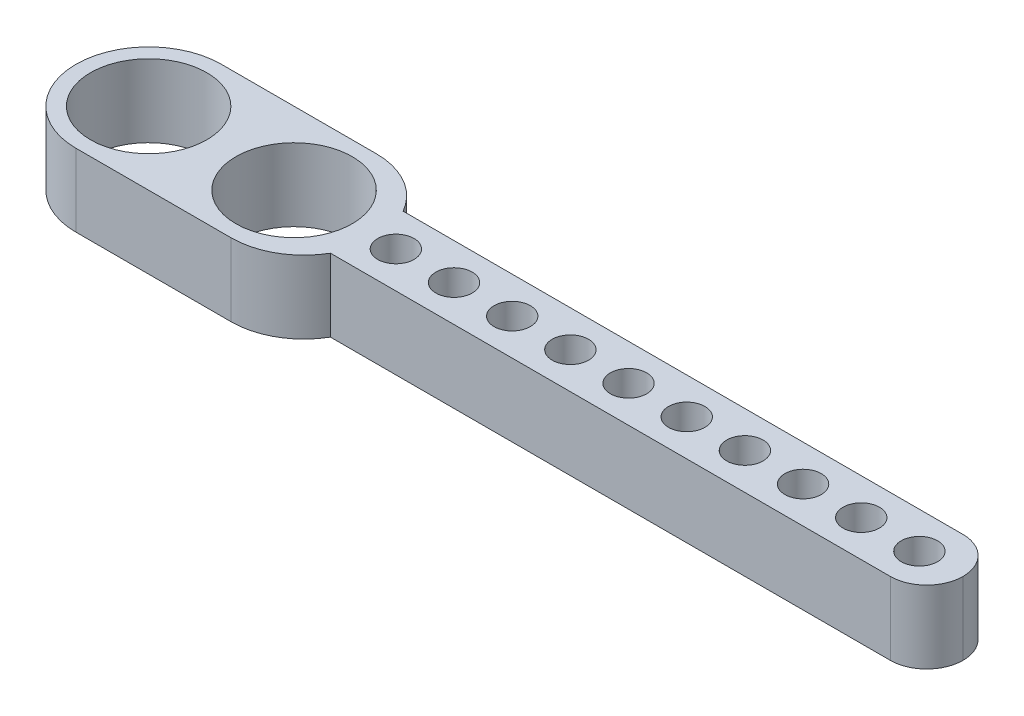
ISO-10303-21;
HEADER;
FILE_DESCRIPTION(('STEP AP214'),'2;1');
FILE_NAME('part.step','',(''),(''),'','','');
FILE_SCHEMA(('AUTOMOTIVE_DESIGN { 1 0 10303 214 1 1 1 1 }'));
ENDSEC;
DATA;
#1=APPLICATION_CONTEXT('core data for automotive mechanical design processes');
#2=APPLICATION_PROTOCOL_DEFINITION('international standard','automotive_design',2000,#1);
#3=PRODUCT_CONTEXT('',#1,'mechanical');
#4=PRODUCT('Part','Part','',(#3));
#5=PRODUCT_RELATED_PRODUCT_CATEGORY('part','',(#4));
#6=PRODUCT_DEFINITION_FORMATION('','',#4);
#7=PRODUCT_DEFINITION_CONTEXT('part definition',#1,'design');
#8=PRODUCT_DEFINITION('design','',#6,#7);
#9=PRODUCT_DEFINITION_SHAPE('','',#8);
#10=(LENGTH_UNIT() NAMED_UNIT(*) SI_UNIT(.MILLI.,.METRE.));
#11=(NAMED_UNIT(*) PLANE_ANGLE_UNIT() SI_UNIT($,.RADIAN.));
#12=(NAMED_UNIT(*) SI_UNIT($,.STERADIAN.) SOLID_ANGLE_UNIT());
#13=UNCERTAINTY_MEASURE_WITH_UNIT(LENGTH_MEASURE(1.E-05),#10,'distance_accuracy_value','');
#14=(GEOMETRIC_REPRESENTATION_CONTEXT(3) GLOBAL_UNCERTAINTY_ASSIGNED_CONTEXT((#13)) GLOBAL_UNIT_ASSIGNED_CONTEXT((#10,
#11,#12)) REPRESENTATION_CONTEXT('',''));
#15=CARTESIAN_POINT('',(0.,0.,0.));
#16=DIRECTION('',(0.,0.,1.));
#17=DIRECTION('',(1.,0.,0.));
#18=AXIS2_PLACEMENT_3D('',#15,#16,#17);
#19=CARTESIAN_POINT('',(0.,6.35,0.));
#20=DIRECTION('',(0.,0.,-1.));
#21=DIRECTION('',(-1.,0.,0.));
#22=AXIS2_PLACEMENT_3D('',#19,#20,#21);
#23=PLANE('',#22);
#24=DIRECTION('',(1.,0.,0.));
#25=VECTOR('',#24,1.);
#26=CARTESIAN_POINT('',(0.,0.,0.));
#27=LINE('',#26,#25);
#28=CARTESIAN_POINT('',(6.35,0.,0.));
#29=VERTEX_POINT('',#28);
#30=CARTESIAN_POINT('',(19.9007386859688,0.,0.));
#31=VERTEX_POINT('',#30);
#32=EDGE_CURVE('E232',#29,#31,#27,.T.);
#33=ORIENTED_EDGE('',*,*,#32,.T.);
#34=DIRECTION('',(0.,-1.,0.));
#35=VECTOR('',#34,1.);
#36=CARTESIAN_POINT('',(19.9007386859688,6.35,0.));
#37=LINE('',#36,#35);
#38=CARTESIAN_POINT('',(19.9007386859688,6.35,0.));
#39=VERTEX_POINT('',#38);
#40=EDGE_CURVE('E182',#31,#39,#37,.F.);
#41=ORIENTED_EDGE('',*,*,#40,.T.);
#42=DIRECTION('',(1.,0.,0.));
#43=VECTOR('',#42,1.);
#44=CARTESIAN_POINT('',(0.,6.35,0.));
#45=LINE('',#44,#43);
#46=CARTESIAN_POINT('',(6.35,6.35,0.));
#47=VERTEX_POINT('',#46);
#48=EDGE_CURVE('E127',#47,#39,#45,.T.);
#49=ORIENTED_EDGE('',*,*,#48,.F.);
#50=DIRECTION('',(0.,-1.,0.));
#51=VECTOR('',#50,1.);
#52=CARTESIAN_POINT('',(6.35,0.,0.));
#53=LINE('',#52,#51);
#54=EDGE_CURVE('E179',#47,#29,#53,.T.);
#55=ORIENTED_EDGE('',*,*,#54,.T.);
#56=EDGE_LOOP('',(#33,#41,#49,#55));
#57=FACE_BOUND('',#56,.T.);
#58=ADVANCED_FACE('F44',(#57),#23,.F.);
#59=CARTESIAN_POINT('',(0.,6.35,-3.175));
#60=DIRECTION('',(0.,0.,-1.));
#61=DIRECTION('',(-1.,0.,0.));
#62=AXIS2_PLACEMENT_3D('',#59,#60,#61);
#63=PLANE('',#62);
#64=DIRECTION('',(1.,0.,0.));
#65=VECTOR('',#64,1.);
#66=CARTESIAN_POINT('',(0.,0.,-3.175));
#67=LINE('',#66,#65);
#68=CARTESIAN_POINT('',(25.4,0.,-3.175));
#69=VERTEX_POINT('',#68);
#70=CARTESIAN_POINT('',(74.295,0.,-3.175));
#71=VERTEX_POINT('',#70);
#72=EDGE_CURVE('E236',#69,#71,#67,.T.);
#73=ORIENTED_EDGE('',*,*,#72,.T.);
#74=DIRECTION('',(0.,-1.,0.));
#75=VECTOR('',#74,1.);
#76=CARTESIAN_POINT('',(74.295,6.35,-3.175));
#77=LINE('',#76,#75);
#78=CARTESIAN_POINT('',(74.295,6.35,-3.175));
#79=VERTEX_POINT('',#78);
#80=EDGE_CURVE('E11',#71,#79,#77,.F.);
#81=ORIENTED_EDGE('',*,*,#80,.T.);
#82=DIRECTION('',(1.,0.,0.));
#83=VECTOR('',#82,1.);
#84=CARTESIAN_POINT('',(0.,6.35,-3.175));
#85=LINE('',#84,#83);
#86=CARTESIAN_POINT('',(25.4,6.35,-3.175));
#87=VERTEX_POINT('',#86);
#88=EDGE_CURVE('E125',#87,#79,#85,.T.);
#89=ORIENTED_EDGE('',*,*,#88,.F.);
#90=DIRECTION('',(0.,-1.,0.));
#91=VECTOR('',#90,1.);
#92=CARTESIAN_POINT('',(25.4,6.35,-3.175));
#93=LINE('',#92,#91);
#94=EDGE_CURVE('E137',#87,#69,#93,.T.);
#95=ORIENTED_EDGE('',*,*,#94,.T.);
#96=EDGE_LOOP('',(#73,#81,#89,#95));
#97=FACE_BOUND('',#96,.T.);
#98=ADVANCED_FACE('F136',(#97),#63,.F.);
#99=CARTESIAN_POINT('',(0.,6.35,-9.525));
#100=DIRECTION('',(0.,0.,-1.));
#101=DIRECTION('',(-1.,0.,0.));
#102=AXIS2_PLACEMENT_3D('',#99,#100,#101);
#103=PLANE('',#102);
#104=DIRECTION('',(1.,0.,0.));
#105=VECTOR('',#104,1.);
#106=CARTESIAN_POINT('',(0.,6.35,-9.525));
#107=LINE('',#106,#105);
#108=CARTESIAN_POINT('',(25.4,6.35,-9.525));
#109=VERTEX_POINT('',#108);
#110=CARTESIAN_POINT('',(74.295,6.35,-9.525));
#111=VERTEX_POINT('',#110);
#112=EDGE_CURVE('E140',#109,#111,#107,.T.);
#113=ORIENTED_EDGE('',*,*,#112,.T.);
#114=DIRECTION('',(0.,-1.,0.));
#115=VECTOR('',#114,1.);
#116=CARTESIAN_POINT('',(74.295,6.35,-9.525));
#117=LINE('',#116,#115);
#118=CARTESIAN_POINT('',(74.295,0.,-9.525));
#119=VERTEX_POINT('',#118);
#120=EDGE_CURVE('E185',#111,#119,#117,.T.);
#121=ORIENTED_EDGE('',*,*,#120,.T.);
#122=DIRECTION('',(1.,0.,0.));
#123=VECTOR('',#122,1.);
#124=CARTESIAN_POINT('',(0.,0.,-9.525));
#125=LINE('',#124,#123);
#126=CARTESIAN_POINT('',(25.4,0.,-9.525));
#127=VERTEX_POINT('',#126);
#128=EDGE_CURVE('E222',#127,#119,#125,.T.);
#129=ORIENTED_EDGE('',*,*,#128,.F.);
#130=DIRECTION('',(0.,-1.,0.));
#131=VECTOR('',#130,1.);
#132=CARTESIAN_POINT('',(25.4,6.35,-9.525));
#133=LINE('',#132,#131);
#134=EDGE_CURVE('E146',#109,#127,#133,.T.);
#135=ORIENTED_EDGE('',*,*,#134,.F.);
#136=EDGE_LOOP('',(#113,#121,#129,#135));
#137=FACE_BOUND('',#136,.T.);
#138=ADVANCED_FACE('F211',(#137),#103,.T.);
#139=CARTESIAN_POINT('',(0.,6.35,-12.7));
#140=DIRECTION('',(0.,0.,-1.));
#141=DIRECTION('',(-1.,0.,0.));
#142=AXIS2_PLACEMENT_3D('',#139,#140,#141);
#143=PLANE('',#142);
#144=DIRECTION('',(1.,0.,0.));
#145=VECTOR('',#144,1.);
#146=CARTESIAN_POINT('',(0.,6.35,-12.7));
#147=LINE('',#146,#145);
#148=CARTESIAN_POINT('',(6.35,6.35,-12.7));
#149=VERTEX_POINT('',#148);
#150=CARTESIAN_POINT('',(19.9007386859688,6.35,-12.7));
#151=VERTEX_POINT('',#150);
#152=EDGE_CURVE('E215',#149,#151,#147,.T.);
#153=ORIENTED_EDGE('',*,*,#152,.T.);
#154=DIRECTION('',(0.,1.,0.));
#155=VECTOR('',#154,1.);
#156=CARTESIAN_POINT('',(19.9007386859688,0.,-12.7));
#157=LINE('',#156,#155);
#158=CARTESIAN_POINT('',(19.9007386859688,0.,-12.7));
#159=VERTEX_POINT('',#158);
#160=EDGE_CURVE('E151',#151,#159,#157,.F.);
#161=ORIENTED_EDGE('',*,*,#160,.T.);
#162=DIRECTION('',(1.,0.,0.));
#163=VECTOR('',#162,1.);
#164=CARTESIAN_POINT('',(0.,0.,-12.7));
#165=LINE('',#164,#163);
#166=CARTESIAN_POINT('',(6.35,0.,-12.7));
#167=VERTEX_POINT('',#166);
#168=EDGE_CURVE('E241',#167,#159,#165,.T.);
#169=ORIENTED_EDGE('',*,*,#168,.F.);
#170=DIRECTION('',(0.,-1.,0.));
#171=VECTOR('',#170,1.);
#172=CARTESIAN_POINT('',(6.35,6.35,-12.7));
#173=LINE('',#172,#171);
#174=EDGE_CURVE('E145',#167,#149,#173,.F.);
#175=ORIENTED_EDGE('',*,*,#174,.T.);
#176=EDGE_LOOP('',(#153,#161,#169,#175));
#177=FACE_BOUND('',#176,.T.);
#178=ADVANCED_FACE('F434',(#177),#143,.T.);
#179=CARTESIAN_POINT('',(33.02,6.35,-6.35));
#180=DIRECTION('',(0.,-1.,0.));
#181=DIRECTION('',(0.,0.,-1.));
#182=AXIS2_PLACEMENT_3D('',#179,#180,#181);
#183=CYLINDRICAL_SURFACE('',#182,1.5875);
#184=CARTESIAN_POINT('',(33.02,6.35,-6.35));
#185=DIRECTION('',(0.,1.,0.));
#186=DIRECTION('',(0.,0.,1.));
#187=AXIS2_PLACEMENT_3D('',#184,#185,#186);
#188=CIRCLE('',#187,1.5875);
#189=CARTESIAN_POINT('',(33.02,6.35,-4.7625));
#190=VERTEX_POINT('',#189);
#191=EDGE_CURVE('E329',#190,#190,#188,.T.);
#192=ORIENTED_EDGE('',*,*,#191,.T.);
#193=EDGE_LOOP('',(#192));
#194=FACE_BOUND('',#193,.T.);
#195=CARTESIAN_POINT('',(33.02,0.,-6.35));
#196=DIRECTION('',(0.,1.,0.));
#197=DIRECTION('',(0.,0.,1.));
#198=AXIS2_PLACEMENT_3D('',#195,#196,#197);
#199=CIRCLE('',#198,1.5875);
#200=CARTESIAN_POINT('',(33.02,0.,-4.7625));
#201=VERTEX_POINT('',#200);
#202=EDGE_CURVE('E277',#201,#201,#199,.T.);
#203=ORIENTED_EDGE('',*,*,#202,.F.);
#204=EDGE_LOOP('',(#203));
#205=FACE_BOUND('',#204,.T.);
#206=ADVANCED_FACE('F444',(#194,#205),#183,.F.);
#207=CARTESIAN_POINT('',(38.1,6.35,-6.35));
#208=DIRECTION('',(0.,-1.,0.));
#209=DIRECTION('',(0.,0.,-1.));
#210=AXIS2_PLACEMENT_3D('',#207,#208,#209);
#211=CYLINDRICAL_SURFACE('',#210,1.5875);
#212=CARTESIAN_POINT('',(38.1,6.35,-6.35));
#213=DIRECTION('',(0.,1.,0.));
#214=DIRECTION('',(0.,0.,1.));
#215=AXIS2_PLACEMENT_3D('',#212,#213,#214);
#216=CIRCLE('',#215,1.5875);
#217=CARTESIAN_POINT('',(38.1,6.35,-4.7625));
#218=VERTEX_POINT('',#217);
#219=EDGE_CURVE('E325',#218,#218,#216,.T.);
#220=ORIENTED_EDGE('',*,*,#219,.T.);
#221=EDGE_LOOP('',(#220));
#222=FACE_BOUND('',#221,.T.);
#223=CARTESIAN_POINT('',(38.1,0.,-6.35));
#224=DIRECTION('',(0.,1.,0.));
#225=DIRECTION('',(0.,0.,1.));
#226=AXIS2_PLACEMENT_3D('',#223,#224,#225);
#227=CIRCLE('',#226,1.5875);
#228=CARTESIAN_POINT('',(38.1,0.,-4.7625));
#229=VERTEX_POINT('',#228);
#230=EDGE_CURVE('E273',#229,#229,#227,.T.);
#231=ORIENTED_EDGE('',*,*,#230,.F.);
#232=EDGE_LOOP('',(#231));
#233=FACE_BOUND('',#232,.T.);
#234=ADVANCED_FACE('F454',(#222,#233),#211,.F.);
#235=CARTESIAN_POINT('',(43.18,6.35,-6.35));
#236=DIRECTION('',(0.,-1.,0.));
#237=DIRECTION('',(0.,0.,-1.));
#238=AXIS2_PLACEMENT_3D('',#235,#236,#237);
#239=CYLINDRICAL_SURFACE('',#238,1.5875);
#240=CARTESIAN_POINT('',(43.18,6.35,-6.35));
#241=DIRECTION('',(0.,1.,0.));
#242=DIRECTION('',(0.,0.,1.));
#243=AXIS2_PLACEMENT_3D('',#240,#241,#242);
#244=CIRCLE('',#243,1.5875);
#245=CARTESIAN_POINT('',(43.18,6.35,-4.7625));
#246=VERTEX_POINT('',#245);
#247=EDGE_CURVE('E321',#246,#246,#244,.T.);
#248=ORIENTED_EDGE('',*,*,#247,.T.);
#249=EDGE_LOOP('',(#248));
#250=FACE_BOUND('',#249,.T.);
#251=CARTESIAN_POINT('',(43.18,0.,-6.35));
#252=DIRECTION('',(0.,1.,0.));
#253=DIRECTION('',(0.,0.,1.));
#254=AXIS2_PLACEMENT_3D('',#251,#252,#253);
#255=CIRCLE('',#254,1.5875);
#256=CARTESIAN_POINT('',(43.18,0.,-4.7625));
#257=VERTEX_POINT('',#256);
#258=EDGE_CURVE('E269',#257,#257,#255,.T.);
#259=ORIENTED_EDGE('',*,*,#258,.F.);
#260=EDGE_LOOP('',(#259));
#261=FACE_BOUND('',#260,.T.);
#262=ADVANCED_FACE('F464',(#250,#261),#239,.F.);
#263=CARTESIAN_POINT('',(48.26,6.35,-6.35));
#264=DIRECTION('',(0.,-1.,0.));
#265=DIRECTION('',(0.,0.,-1.));
#266=AXIS2_PLACEMENT_3D('',#263,#264,#265);
#267=CYLINDRICAL_SURFACE('',#266,1.5875);
#268=CARTESIAN_POINT('',(48.26,6.35,-6.35));
#269=DIRECTION('',(0.,1.,0.));
#270=DIRECTION('',(0.,0.,1.));
#271=AXIS2_PLACEMENT_3D('',#268,#269,#270);
#272=CIRCLE('',#271,1.5875);
#273=CARTESIAN_POINT('',(48.26,6.35,-4.7625));
#274=VERTEX_POINT('',#273);
#275=EDGE_CURVE('E317',#274,#274,#272,.T.);
#276=ORIENTED_EDGE('',*,*,#275,.T.);
#277=EDGE_LOOP('',(#276));
#278=FACE_BOUND('',#277,.T.);
#279=CARTESIAN_POINT('',(48.26,0.,-6.35));
#280=DIRECTION('',(0.,1.,0.));
#281=DIRECTION('',(0.,0.,1.));
#282=AXIS2_PLACEMENT_3D('',#279,#280,#281);
#283=CIRCLE('',#282,1.5875);
#284=CARTESIAN_POINT('',(48.26,0.,-4.7625));
#285=VERTEX_POINT('',#284);
#286=EDGE_CURVE('E265',#285,#285,#283,.T.);
#287=ORIENTED_EDGE('',*,*,#286,.F.);
#288=EDGE_LOOP('',(#287));
#289=FACE_BOUND('',#288,.T.);
#290=ADVANCED_FACE('F474',(#278,#289),#267,.F.);
#291=CARTESIAN_POINT('',(53.34,6.35,-6.35));
#292=DIRECTION('',(0.,-1.,0.));
#293=DIRECTION('',(0.,0.,-1.));
#294=AXIS2_PLACEMENT_3D('',#291,#292,#293);
#295=CYLINDRICAL_SURFACE('',#294,1.5875);
#296=CARTESIAN_POINT('',(53.34,6.35,-6.35));
#297=DIRECTION('',(0.,1.,0.));
#298=DIRECTION('',(0.,0.,1.));
#299=AXIS2_PLACEMENT_3D('',#296,#297,#298);
#300=CIRCLE('',#299,1.5875);
#301=CARTESIAN_POINT('',(53.34,6.35,-4.7625));
#302=VERTEX_POINT('',#301);
#303=EDGE_CURVE('E313',#302,#302,#300,.T.);
#304=ORIENTED_EDGE('',*,*,#303,.T.);
#305=EDGE_LOOP('',(#304));
#306=FACE_BOUND('',#305,.T.);
#307=CARTESIAN_POINT('',(53.34,0.,-6.35));
#308=DIRECTION('',(0.,1.,0.));
#309=DIRECTION('',(0.,0.,1.));
#310=AXIS2_PLACEMENT_3D('',#307,#308,#309);
#311=CIRCLE('',#310,1.5875);
#312=CARTESIAN_POINT('',(53.34,0.,-4.7625));
#313=VERTEX_POINT('',#312);
#314=EDGE_CURVE('E261',#313,#313,#311,.T.);
#315=ORIENTED_EDGE('',*,*,#314,.F.);
#316=EDGE_LOOP('',(#315));
#317=FACE_BOUND('',#316,.T.);
#318=ADVANCED_FACE('F484',(#306,#317),#295,.F.);
#319=CARTESIAN_POINT('',(58.42,6.35,-6.35));
#320=DIRECTION('',(0.,-1.,0.));
#321=DIRECTION('',(0.,0.,-1.));
#322=AXIS2_PLACEMENT_3D('',#319,#320,#321);
#323=CYLINDRICAL_SURFACE('',#322,1.5875);
#324=CARTESIAN_POINT('',(58.42,6.35,-6.35));
#325=DIRECTION('',(0.,1.,0.));
#326=DIRECTION('',(0.,0.,1.));
#327=AXIS2_PLACEMENT_3D('',#324,#325,#326);
#328=CIRCLE('',#327,1.5875);
#329=CARTESIAN_POINT('',(58.42,6.35,-4.7625));
#330=VERTEX_POINT('',#329);
#331=EDGE_CURVE('E309',#330,#330,#328,.T.);
#332=ORIENTED_EDGE('',*,*,#331,.T.);
#333=EDGE_LOOP('',(#332));
#334=FACE_BOUND('',#333,.T.);
#335=CARTESIAN_POINT('',(58.42,0.,-6.35));
#336=DIRECTION('',(0.,1.,0.));
#337=DIRECTION('',(0.,0.,1.));
#338=AXIS2_PLACEMENT_3D('',#335,#336,#337);
#339=CIRCLE('',#338,1.5875);
#340=CARTESIAN_POINT('',(58.42,0.,-4.7625));
#341=VERTEX_POINT('',#340);
#342=EDGE_CURVE('E257',#341,#341,#339,.T.);
#343=ORIENTED_EDGE('',*,*,#342,.F.);
#344=EDGE_LOOP('',(#343));
#345=FACE_BOUND('',#344,.T.);
#346=ADVANCED_FACE('F494',(#334,#345),#323,.F.);
#347=CARTESIAN_POINT('',(63.5,6.35,-6.35));
#348=DIRECTION('',(0.,-1.,0.));
#349=DIRECTION('',(0.,0.,-1.));
#350=AXIS2_PLACEMENT_3D('',#347,#348,#349);
#351=CYLINDRICAL_SURFACE('',#350,1.5875);
#352=CARTESIAN_POINT('',(63.5,6.35,-6.35));
#353=DIRECTION('',(0.,1.,0.));
#354=DIRECTION('',(0.,0.,1.));
#355=AXIS2_PLACEMENT_3D('',#352,#353,#354);
#356=CIRCLE('',#355,1.5875);
#357=CARTESIAN_POINT('',(63.5,6.35,-4.7625));
#358=VERTEX_POINT('',#357);
#359=EDGE_CURVE('E305',#358,#358,#356,.T.);
#360=ORIENTED_EDGE('',*,*,#359,.T.);
#361=EDGE_LOOP('',(#360));
#362=FACE_BOUND('',#361,.T.);
#363=CARTESIAN_POINT('',(63.5,0.,-6.35));
#364=DIRECTION('',(0.,1.,0.));
#365=DIRECTION('',(0.,0.,1.));
#366=AXIS2_PLACEMENT_3D('',#363,#364,#365);
#367=CIRCLE('',#366,1.5875);
#368=CARTESIAN_POINT('',(63.5,0.,-4.7625));
#369=VERTEX_POINT('',#368);
#370=EDGE_CURVE('E253',#369,#369,#367,.T.);
#371=ORIENTED_EDGE('',*,*,#370,.F.);
#372=EDGE_LOOP('',(#371));
#373=FACE_BOUND('',#372,.T.);
#374=ADVANCED_FACE('F504',(#362,#373),#351,.F.);
#375=CARTESIAN_POINT('',(68.58,6.35,-6.35));
#376=DIRECTION('',(0.,-1.,0.));
#377=DIRECTION('',(0.,0.,-1.));
#378=AXIS2_PLACEMENT_3D('',#375,#376,#377);
#379=CYLINDRICAL_SURFACE('',#378,1.5875);
#380=CARTESIAN_POINT('',(68.58,6.35,-6.35));
#381=DIRECTION('',(0.,1.,0.));
#382=DIRECTION('',(0.,0.,1.));
#383=AXIS2_PLACEMENT_3D('',#380,#381,#382);
#384=CIRCLE('',#383,1.5875);
#385=CARTESIAN_POINT('',(68.58,6.35,-4.7625));
#386=VERTEX_POINT('',#385);
#387=EDGE_CURVE('E301',#386,#386,#384,.T.);
#388=ORIENTED_EDGE('',*,*,#387,.T.);
#389=EDGE_LOOP('',(#388));
#390=FACE_BOUND('',#389,.T.);
#391=CARTESIAN_POINT('',(68.58,0.,-6.35));
#392=DIRECTION('',(0.,1.,0.));
#393=DIRECTION('',(0.,0.,1.));
#394=AXIS2_PLACEMENT_3D('',#391,#392,#393);
#395=CIRCLE('',#394,1.5875);
#396=CARTESIAN_POINT('',(68.58,0.,-4.7625));
#397=VERTEX_POINT('',#396);
#398=EDGE_CURVE('E249',#397,#397,#395,.T.);
#399=ORIENTED_EDGE('',*,*,#398,.F.);
#400=EDGE_LOOP('',(#399));
#401=FACE_BOUND('',#400,.T.);
#402=ADVANCED_FACE('F514',(#390,#401),#379,.F.);
#403=CARTESIAN_POINT('',(73.66,6.35,-6.35));
#404=DIRECTION('',(0.,-1.,0.));
#405=DIRECTION('',(0.,0.,-1.));
#406=AXIS2_PLACEMENT_3D('',#403,#404,#405);
#407=CYLINDRICAL_SURFACE('',#406,1.5875);
#408=CARTESIAN_POINT('',(73.66,6.35,-6.35));
#409=DIRECTION('',(0.,1.,0.));
#410=DIRECTION('',(0.,0.,1.));
#411=AXIS2_PLACEMENT_3D('',#408,#409,#410);
#412=CIRCLE('',#411,1.5875);
#413=CARTESIAN_POINT('',(73.66,6.35,-4.7625));
#414=VERTEX_POINT('',#413);
#415=EDGE_CURVE('E297',#414,#414,#412,.T.);
#416=ORIENTED_EDGE('',*,*,#415,.T.);
#417=EDGE_LOOP('',(#416));
#418=FACE_BOUND('',#417,.T.);
#419=CARTESIAN_POINT('',(73.66,0.,-6.35));
#420=DIRECTION('',(0.,1.,0.));
#421=DIRECTION('',(0.,0.,1.));
#422=AXIS2_PLACEMENT_3D('',#419,#420,#421);
#423=CIRCLE('',#422,1.5875);
#424=CARTESIAN_POINT('',(73.66,0.,-4.7625));
#425=VERTEX_POINT('',#424);
#426=EDGE_CURVE('E245',#425,#425,#423,.T.);
#427=ORIENTED_EDGE('',*,*,#426,.F.);
#428=EDGE_LOOP('',(#427));
#429=FACE_BOUND('',#428,.T.);
#430=ADVANCED_FACE('F369',(#418,#429),#407,.F.);
#431=CARTESIAN_POINT('',(6.35,6.35,-6.35));
#432=DIRECTION('',(0.,-1.,0.));
#433=DIRECTION('',(0.,0.,-1.));
#434=AXIS2_PLACEMENT_3D('',#431,#432,#433);
#435=CYLINDRICAL_SURFACE('',#434,5.08);
#436=CARTESIAN_POINT('',(6.35,6.35,-6.35));
#437=DIRECTION('',(0.,1.,0.));
#438=DIRECTION('',(0.,0.,1.));
#439=AXIS2_PLACEMENT_3D('',#436,#437,#438);
#440=CIRCLE('',#439,5.08);
#441=CARTESIAN_POINT('',(6.35,6.35,-1.27));
#442=VERTEX_POINT('',#441);
#443=EDGE_CURVE('E288',#442,#442,#440,.T.);
#444=ORIENTED_EDGE('',*,*,#443,.T.);
#445=EDGE_LOOP('',(#444));
#446=FACE_BOUND('',#445,.T.);
#447=CARTESIAN_POINT('',(6.35,0.,-6.35));
#448=DIRECTION('',(0.,1.,0.));
#449=DIRECTION('',(0.,0.,1.));
#450=AXIS2_PLACEMENT_3D('',#447,#448,#449);
#451=CIRCLE('',#450,5.08);
#452=CARTESIAN_POINT('',(6.35,0.,-1.27));
#453=VERTEX_POINT('',#452);
#454=EDGE_CURVE('E228',#453,#453,#451,.T.);
#455=ORIENTED_EDGE('',*,*,#454,.F.);
#456=EDGE_LOOP('',(#455));
#457=FACE_BOUND('',#456,.T.);
#458=ADVANCED_FACE('F366',(#446,#457),#435,.F.);
#459=CARTESIAN_POINT('',(19.05,6.35,-6.35));
#460=DIRECTION('',(0.,-1.,0.));
#461=DIRECTION('',(0.,0.,-1.));
#462=AXIS2_PLACEMENT_3D('',#459,#460,#461);
#463=CYLINDRICAL_SURFACE('',#462,5.08);
#464=CARTESIAN_POINT('',(19.05,6.35,-6.35));
#465=DIRECTION('',(0.,1.,0.));
#466=DIRECTION('',(0.,0.,1.));
#467=AXIS2_PLACEMENT_3D('',#464,#465,#466);
#468=CIRCLE('',#467,5.08);
#469=CARTESIAN_POINT('',(19.05,6.35,-1.27));
#470=VERTEX_POINT('',#469);
#471=EDGE_CURVE('E285',#470,#470,#468,.T.);
#472=ORIENTED_EDGE('',*,*,#471,.T.);
#473=EDGE_LOOP('',(#472));
#474=FACE_BOUND('',#473,.T.);
#475=CARTESIAN_POINT('',(19.05,0.,-6.35));
#476=DIRECTION('',(0.,1.,0.));
#477=DIRECTION('',(0.,0.,1.));
#478=AXIS2_PLACEMENT_3D('',#475,#476,#477);
#479=CIRCLE('',#478,5.08);
#480=CARTESIAN_POINT('',(19.05,0.,-1.27));
#481=VERTEX_POINT('',#480);
#482=EDGE_CURVE('E190',#481,#481,#479,.T.);
#483=ORIENTED_EDGE('',*,*,#482,.F.);
#484=EDGE_LOOP('',(#483));
#485=FACE_BOUND('',#484,.T.);
#486=ADVANCED_FACE('F352',(#474,#485),#463,.F.);
#487=CARTESIAN_POINT('',(27.94,6.35,-6.35));
#488=DIRECTION('',(0.,-1.,0.));
#489=DIRECTION('',(0.,0.,-1.));
#490=AXIS2_PLACEMENT_3D('',#487,#488,#489);
#491=CYLINDRICAL_SURFACE('',#490,1.5875);
#492=CARTESIAN_POINT('',(27.94,6.35,-6.35));
#493=DIRECTION('',(0.,1.,0.));
#494=DIRECTION('',(0.,0.,1.));
#495=AXIS2_PLACEMENT_3D('',#492,#493,#494);
#496=CIRCLE('',#495,1.5875);
#497=CARTESIAN_POINT('',(27.94,6.35,-4.7625));
#498=VERTEX_POINT('',#497);
#499=EDGE_CURVE('E154',#498,#498,#496,.T.);
#500=ORIENTED_EDGE('',*,*,#499,.T.);
#501=EDGE_LOOP('',(#500));
#502=FACE_BOUND('',#501,.T.);
#503=CARTESIAN_POINT('',(27.94,0.,-6.35));
#504=DIRECTION('',(0.,1.,0.));
#505=DIRECTION('',(0.,0.,1.));
#506=AXIS2_PLACEMENT_3D('',#503,#504,#505);
#507=CIRCLE('',#506,1.5875);
#508=CARTESIAN_POINT('',(27.94,0.,-4.7625));
#509=VERTEX_POINT('',#508);
#510=EDGE_CURVE('E281',#509,#509,#507,.T.);
#511=ORIENTED_EDGE('',*,*,#510,.F.);
#512=EDGE_LOOP('',(#511));
#513=FACE_BOUND('',#512,.T.);
#514=ADVANCED_FACE('F338',(#502,#513),#491,.F.);
#515=CARTESIAN_POINT('',(0.,6.35,0.));
#516=DIRECTION('',(0.,1.,0.));
#517=DIRECTION('',(0.,0.,1.));
#518=AXIS2_PLACEMENT_3D('',#515,#516,#517);
#519=PLANE('',#518);
#520=ORIENTED_EDGE('',*,*,#471,.F.);
#521=EDGE_LOOP('',(#520));
#522=FACE_BOUND('',#521,.T.);
#523=ORIENTED_EDGE('',*,*,#443,.F.);
#524=EDGE_LOOP('',(#523));
#525=FACE_BOUND('',#524,.T.);
#526=CARTESIAN_POINT('',(74.295,6.35,-6.35));
#527=DIRECTION('',(0.,1.,0.));
#528=DIRECTION('',(0.,0.,1.));
#529=AXIS2_PLACEMENT_3D('',#526,#527,#528);
#530=CIRCLE('',#529,3.175);
#531=CARTESIAN_POINT('',(77.47,6.35,-6.35));
#532=VERTEX_POINT('',#531);
#533=EDGE_CURVE('E61',#79,#532,#530,.T.);
#534=ORIENTED_EDGE('',*,*,#533,.T.);
#535=CARTESIAN_POINT('',(74.295,6.35,-6.35));
#536=DIRECTION('',(0.,1.,0.));
#537=DIRECTION('',(0.,0.,1.));
#538=AXIS2_PLACEMENT_3D('',#535,#536,#537);
#539=CIRCLE('',#538,3.175);
#540=EDGE_CURVE('E54',#532,#111,#539,.T.);
#541=ORIENTED_EDGE('',*,*,#540,.T.);
#542=ORIENTED_EDGE('',*,*,#112,.F.);
#543=CARTESIAN_POINT('',(19.9007386859688,6.35,-6.35));
#544=DIRECTION('',(0.,1.,0.));
#545=DIRECTION('',(0.,0.,1.));
#546=AXIS2_PLACEMENT_3D('',#543,#544,#545);
#547=CIRCLE('',#546,6.35);
#548=EDGE_CURVE('E132',#109,#151,#547,.T.);
#549=ORIENTED_EDGE('',*,*,#548,.T.);
#550=ORIENTED_EDGE('',*,*,#152,.F.);
#551=CARTESIAN_POINT('',(6.35,6.35,-6.35));
#552=DIRECTION('',(0.,1.,0.));
#553=DIRECTION('',(0.,0.,1.));
#554=AXIS2_PLACEMENT_3D('',#551,#552,#553);
#555=CIRCLE('',#554,6.35);
#556=CARTESIAN_POINT('',(0.,6.35,-6.35));
#557=VERTEX_POINT('',#556);
#558=EDGE_CURVE('E133',#149,#557,#555,.T.);
#559=ORIENTED_EDGE('',*,*,#558,.T.);
#560=CARTESIAN_POINT('',(6.35,6.35,-6.35));
#561=DIRECTION('',(0.,1.,0.));
#562=DIRECTION('',(0.,0.,1.));
#563=AXIS2_PLACEMENT_3D('',#560,#561,#562);
#564=CIRCLE('',#563,6.35);
#565=EDGE_CURVE('E172',#557,#47,#564,.T.);
#566=ORIENTED_EDGE('',*,*,#565,.T.);
#567=ORIENTED_EDGE('',*,*,#48,.T.);
#568=CARTESIAN_POINT('',(19.9007386859688,6.35,-6.35));
#569=DIRECTION('',(0.,1.,0.));
#570=DIRECTION('',(0.,0.,1.));
#571=AXIS2_PLACEMENT_3D('',#568,#569,#570);
#572=CIRCLE('',#571,6.35);
#573=EDGE_CURVE('E122',#39,#87,#572,.T.);
#574=ORIENTED_EDGE('',*,*,#573,.T.);
#575=ORIENTED_EDGE('',*,*,#88,.T.);
#576=EDGE_LOOP('',(#534,#541,#542,#549,#550,#559,#566,#567,#574,#575));
#577=FACE_BOUND('',#576,.T.);
#578=ORIENTED_EDGE('',*,*,#415,.F.);
#579=EDGE_LOOP('',(#578));
#580=FACE_BOUND('',#579,.T.);
#581=ORIENTED_EDGE('',*,*,#387,.F.);
#582=EDGE_LOOP('',(#581));
#583=FACE_BOUND('',#582,.T.);
#584=ORIENTED_EDGE('',*,*,#359,.F.);
#585=EDGE_LOOP('',(#584));
#586=FACE_BOUND('',#585,.T.);
#587=ORIENTED_EDGE('',*,*,#331,.F.);
#588=EDGE_LOOP('',(#587));
#589=FACE_BOUND('',#588,.T.);
#590=ORIENTED_EDGE('',*,*,#303,.F.);
#591=EDGE_LOOP('',(#590));
#592=FACE_BOUND('',#591,.T.);
#593=ORIENTED_EDGE('',*,*,#275,.F.);
#594=EDGE_LOOP('',(#593));
#595=FACE_BOUND('',#594,.T.);
#596=ORIENTED_EDGE('',*,*,#247,.F.);
#597=EDGE_LOOP('',(#596));
#598=FACE_BOUND('',#597,.T.);
#599=ORIENTED_EDGE('',*,*,#219,.F.);
#600=EDGE_LOOP('',(#599));
#601=FACE_BOUND('',#600,.T.);
#602=ORIENTED_EDGE('',*,*,#191,.F.);
#603=EDGE_LOOP('',(#602));
#604=FACE_BOUND('',#603,.T.);
#605=ORIENTED_EDGE('',*,*,#499,.F.);
#606=EDGE_LOOP('',(#605));
#607=FACE_BOUND('',#606,.T.);
#608=ADVANCED_FACE('F123',(#522,#525,#577,#580,#583,#586,#589,#592,#595,#598,#601,#604,#607),
#519,.T.);
#609=CARTESIAN_POINT('',(0.,0.,0.));
#610=DIRECTION('',(0.,1.,0.));
#611=DIRECTION('',(0.,0.,1.));
#612=AXIS2_PLACEMENT_3D('',#609,#610,#611);
#613=PLANE('',#612);
#614=ORIENTED_EDGE('',*,*,#482,.T.);
#615=EDGE_LOOP('',(#614));
#616=FACE_BOUND('',#615,.T.);
#617=ORIENTED_EDGE('',*,*,#454,.T.);
#618=EDGE_LOOP('',(#617));
#619=FACE_BOUND('',#618,.T.);
#620=ORIENTED_EDGE('',*,*,#128,.T.);
#621=CARTESIAN_POINT('',(74.295,0.,-6.35));
#622=DIRECTION('',(0.,1.,0.));
#623=DIRECTION('',(0.,0.,1.));
#624=AXIS2_PLACEMENT_3D('',#621,#622,#623);
#625=CIRCLE('',#624,3.175);
#626=CARTESIAN_POINT('',(77.47,0.,-6.35));
#627=VERTEX_POINT('',#626);
#628=EDGE_CURVE('E197',#119,#627,#625,.F.);
#629=ORIENTED_EDGE('',*,*,#628,.T.);
#630=CARTESIAN_POINT('',(74.295,0.,-6.35));
#631=DIRECTION('',(0.,1.,0.));
#632=DIRECTION('',(0.,0.,1.));
#633=AXIS2_PLACEMENT_3D('',#630,#631,#632);
#634=CIRCLE('',#633,3.175);
#635=EDGE_CURVE('E194',#627,#71,#634,.F.);
#636=ORIENTED_EDGE('',*,*,#635,.T.);
#637=ORIENTED_EDGE('',*,*,#72,.F.);
#638=CARTESIAN_POINT('',(19.9007386859688,0.,-6.35));
#639=DIRECTION('',(0.,1.,0.));
#640=DIRECTION('',(0.,0.,1.));
#641=AXIS2_PLACEMENT_3D('',#638,#639,#640);
#642=CIRCLE('',#641,6.35);
#643=EDGE_CURVE('E143',#69,#31,#642,.F.);
#644=ORIENTED_EDGE('',*,*,#643,.T.);
#645=ORIENTED_EDGE('',*,*,#32,.F.);
#646=CARTESIAN_POINT('',(6.35,0.,-6.35));
#647=DIRECTION('',(0.,1.,0.));
#648=DIRECTION('',(0.,0.,1.));
#649=AXIS2_PLACEMENT_3D('',#646,#647,#648);
#650=CIRCLE('',#649,6.35);
#651=CARTESIAN_POINT('',(0.,0.,-6.35));
#652=VERTEX_POINT('',#651);
#653=EDGE_CURVE('E161',#29,#652,#650,.F.);
#654=ORIENTED_EDGE('',*,*,#653,.T.);
#655=CARTESIAN_POINT('',(6.35,0.,-6.35));
#656=DIRECTION('',(0.,1.,0.));
#657=DIRECTION('',(0.,0.,1.));
#658=AXIS2_PLACEMENT_3D('',#655,#656,#657);
#659=CIRCLE('',#658,6.35);
#660=EDGE_CURVE('E164',#652,#167,#659,.F.);
#661=ORIENTED_EDGE('',*,*,#660,.T.);
#662=ORIENTED_EDGE('',*,*,#168,.T.);
#663=CARTESIAN_POINT('',(19.9007386859688,0.,-6.35));
#664=DIRECTION('',(0.,1.,0.));
#665=DIRECTION('',(0.,0.,1.));
#666=AXIS2_PLACEMENT_3D('',#663,#664,#665);
#667=CIRCLE('',#666,6.35);
#668=EDGE_CURVE('E169',#159,#127,#667,.F.);
#669=ORIENTED_EDGE('',*,*,#668,.T.);
#670=EDGE_LOOP('',(#620,#629,#636,#637,#644,#645,#654,#661,#662,#669));
#671=FACE_BOUND('',#670,.T.);
#672=ORIENTED_EDGE('',*,*,#426,.T.);
#673=EDGE_LOOP('',(#672));
#674=FACE_BOUND('',#673,.T.);
#675=ORIENTED_EDGE('',*,*,#398,.T.);
#676=EDGE_LOOP('',(#675));
#677=FACE_BOUND('',#676,.T.);
#678=ORIENTED_EDGE('',*,*,#370,.T.);
#679=EDGE_LOOP('',(#678));
#680=FACE_BOUND('',#679,.T.);
#681=ORIENTED_EDGE('',*,*,#342,.T.);
#682=EDGE_LOOP('',(#681));
#683=FACE_BOUND('',#682,.T.);
#684=ORIENTED_EDGE('',*,*,#314,.T.);
#685=EDGE_LOOP('',(#684));
#686=FACE_BOUND('',#685,.T.);
#687=ORIENTED_EDGE('',*,*,#286,.T.);
#688=EDGE_LOOP('',(#687));
#689=FACE_BOUND('',#688,.T.);
#690=ORIENTED_EDGE('',*,*,#258,.T.);
#691=EDGE_LOOP('',(#690));
#692=FACE_BOUND('',#691,.T.);
#693=ORIENTED_EDGE('',*,*,#230,.T.);
#694=EDGE_LOOP('',(#693));
#695=FACE_BOUND('',#694,.T.);
#696=ORIENTED_EDGE('',*,*,#202,.T.);
#697=EDGE_LOOP('',(#696));
#698=FACE_BOUND('',#697,.T.);
#699=ORIENTED_EDGE('',*,*,#510,.T.);
#700=EDGE_LOOP('',(#699));
#701=FACE_BOUND('',#700,.T.);
#702=ADVANCED_FACE('F220',(#616,#619,#671,#674,#677,#680,#683,#686,#689,#692,#695,#698,#701),
#613,.F.);
#703=CARTESIAN_POINT('',(19.9007386859688,6.35,-6.35));
#704=DIRECTION('',(0.,-1.,0.));
#705=DIRECTION('',(0.,0.,-1.));
#706=AXIS2_PLACEMENT_3D('',#703,#704,#705);
#707=CYLINDRICAL_SURFACE('',#706,6.35);
#708=ORIENTED_EDGE('',*,*,#548,.F.);
#709=ORIENTED_EDGE('',*,*,#134,.T.);
#710=ORIENTED_EDGE('',*,*,#668,.F.);
#711=ORIENTED_EDGE('',*,*,#160,.F.);
#712=EDGE_LOOP('',(#708,#709,#710,#711));
#713=FACE_BOUND('',#712,.T.);
#714=ADVANCED_FACE('F348',(#713),#707,.T.);
#715=CARTESIAN_POINT('',(19.9007386859688,6.35,-6.35));
#716=DIRECTION('',(0.,-1.,0.));
#717=DIRECTION('',(0.,0.,-1.));
#718=AXIS2_PLACEMENT_3D('',#715,#716,#717);
#719=CYLINDRICAL_SURFACE('',#718,6.35);
#720=ORIENTED_EDGE('',*,*,#573,.F.);
#721=ORIENTED_EDGE('',*,*,#40,.F.);
#722=ORIENTED_EDGE('',*,*,#643,.F.);
#723=ORIENTED_EDGE('',*,*,#94,.F.);
#724=EDGE_LOOP('',(#720,#721,#722,#723));
#725=FACE_BOUND('',#724,.T.);
#726=ADVANCED_FACE('F142',(#725),#719,.T.);
#727=CARTESIAN_POINT('',(6.35,6.35,-6.35));
#728=DIRECTION('',(0.,1.,0.));
#729=DIRECTION('',(0.,0.,1.));
#730=AXIS2_PLACEMENT_3D('',#727,#728,#729);
#731=CYLINDRICAL_SURFACE('',#730,6.35);
#732=ORIENTED_EDGE('',*,*,#54,.F.);
#733=ORIENTED_EDGE('',*,*,#565,.F.);
#734=DIRECTION('',(0.,-1.,0.));
#735=VECTOR('',#734,1.);
#736=CARTESIAN_POINT('',(0.,6.35,-6.35));
#737=LINE('',#736,#735);
#738=EDGE_CURVE('E186',#652,#557,#737,.F.);
#739=ORIENTED_EDGE('',*,*,#738,.F.);
#740=ORIENTED_EDGE('',*,*,#653,.F.);
#741=EDGE_LOOP('',(#732,#733,#739,#740));
#742=FACE_BOUND('',#741,.T.);
#743=ADVANCED_FACE('F379',(#742),#731,.T.);
#744=CARTESIAN_POINT('',(6.35,6.35,-6.35));
#745=DIRECTION('',(0.,-1.,0.));
#746=DIRECTION('',(0.,0.,-1.));
#747=AXIS2_PLACEMENT_3D('',#744,#745,#746);
#748=CYLINDRICAL_SURFACE('',#747,6.35);
#749=ORIENTED_EDGE('',*,*,#558,.F.);
#750=ORIENTED_EDGE('',*,*,#174,.F.);
#751=ORIENTED_EDGE('',*,*,#660,.F.);
#752=ORIENTED_EDGE('',*,*,#738,.T.);
#753=EDGE_LOOP('',(#749,#750,#751,#752));
#754=FACE_BOUND('',#753,.T.);
#755=ADVANCED_FACE('F380',(#754),#748,.T.);
#756=CARTESIAN_POINT('',(74.295,6.35,-6.35));
#757=DIRECTION('',(0.,1.,0.));
#758=DIRECTION('',(0.,0.,1.));
#759=AXIS2_PLACEMENT_3D('',#756,#757,#758);
#760=CYLINDRICAL_SURFACE('',#759,3.175);
#761=DIRECTION('',(0.,-1.,0.));
#762=VECTOR('',#761,1.);
#763=CARTESIAN_POINT('',(77.47,0.,-6.35));
#764=LINE('',#763,#762);
#765=EDGE_CURVE('E48',#532,#627,#764,.T.);
#766=ORIENTED_EDGE('',*,*,#765,.F.);
#767=ORIENTED_EDGE('',*,*,#533,.F.);
#768=ORIENTED_EDGE('',*,*,#80,.F.);
#769=ORIENTED_EDGE('',*,*,#635,.F.);
#770=EDGE_LOOP('',(#766,#767,#768,#769));
#771=FACE_BOUND('',#770,.T.);
#772=ADVANCED_FACE('F46',(#771),#760,.T.);
#773=CARTESIAN_POINT('',(74.295,6.35,-6.35));
#774=DIRECTION('',(0.,-1.,0.));
#775=DIRECTION('',(0.,0.,-1.));
#776=AXIS2_PLACEMENT_3D('',#773,#774,#775);
#777=CYLINDRICAL_SURFACE('',#776,3.175);
#778=ORIENTED_EDGE('',*,*,#540,.F.);
#779=ORIENTED_EDGE('',*,*,#765,.T.);
#780=ORIENTED_EDGE('',*,*,#628,.F.);
#781=ORIENTED_EDGE('',*,*,#120,.F.);
#782=EDGE_LOOP('',(#778,#779,#780,#781));
#783=FACE_BOUND('',#782,.T.);
#784=ADVANCED_FACE('F217',(#783),#777,.T.);
#785=CLOSED_SHELL('',(#58,#98,#138,#178,#206,#234,#262,#290,#318,#346,#374,#402,#430,#458,#486,
#514,#608,#702,#714,#726,#743,#755,#772,#784));
#786=MANIFOLD_SOLID_BREP('B2',#785);
#787=ADVANCED_BREP_SHAPE_REPRESENTATION('',(#18,#786),#14);
#788=SHAPE_DEFINITION_REPRESENTATION(#9,#787);
ENDSEC;
END-ISO-10303-21;
